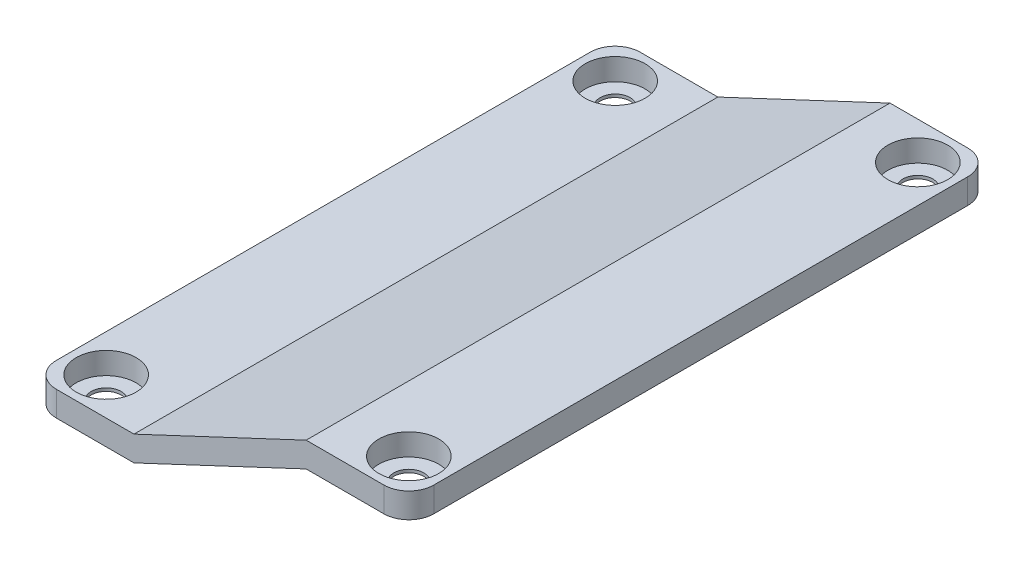
ISO-10303-21;
HEADER;
FILE_DESCRIPTION(('STEP AP214'),'2;1');
FILE_NAME('part.step','',(''),(''),'','','');
FILE_SCHEMA(('AUTOMOTIVE_DESIGN { 1 0 10303 214 1 1 1 1 }'));
ENDSEC;
DATA;
#1=APPLICATION_CONTEXT('core data for automotive mechanical design processes');
#2=APPLICATION_PROTOCOL_DEFINITION('international standard','automotive_design',2000,#1);
#3=PRODUCT_CONTEXT('',#1,'mechanical');
#4=PRODUCT('Part','Part','',(#3));
#5=PRODUCT_RELATED_PRODUCT_CATEGORY('part','',(#4));
#6=PRODUCT_DEFINITION_FORMATION('','',#4);
#7=PRODUCT_DEFINITION_CONTEXT('part definition',#1,'design');
#8=PRODUCT_DEFINITION('design','',#6,#7);
#9=PRODUCT_DEFINITION_SHAPE('','',#8);
#10=(LENGTH_UNIT() NAMED_UNIT(*) SI_UNIT(.MILLI.,.METRE.));
#11=(NAMED_UNIT(*) PLANE_ANGLE_UNIT() SI_UNIT($,.RADIAN.));
#12=(NAMED_UNIT(*) SI_UNIT($,.STERADIAN.) SOLID_ANGLE_UNIT());
#13=UNCERTAINTY_MEASURE_WITH_UNIT(LENGTH_MEASURE(1.E-05),#10,'distance_accuracy_value','');
#14=(GEOMETRIC_REPRESENTATION_CONTEXT(3) GLOBAL_UNCERTAINTY_ASSIGNED_CONTEXT((#13)) GLOBAL_UNIT_ASSIGNED_CONTEXT((#10,
#11,#12)) REPRESENTATION_CONTEXT('',''));
#15=CARTESIAN_POINT('',(0.,0.,0.));
#16=DIRECTION('',(0.,0.,1.));
#17=DIRECTION('',(1.,0.,0.));
#18=AXIS2_PLACEMENT_3D('',#15,#16,#17);
#19=CARTESIAN_POINT('',(-17.5077541769523,-9.56898329219079,-117.));
#20=DIRECTION('',(0.425038765055335,-0.905175147803029,0.));
#21=DIRECTION('',(0.905175147803029,0.425038765055335,0.));
#22=AXIS2_PLACEMENT_3D('',#19,#20,#21);
#23=PLANE('',#22);
#24=DIRECTION('',(0.905175147803029,0.425038765055335,0.));
#25=VECTOR('',#24,1.);
#26=CARTESIAN_POINT('',(-17.5077541769523,-9.56898329219079,0.));
#27=LINE('',#26,#25);
#28=CARTESIAN_POINT('',(-17.5077541769523,-9.56898329219079,0.));
#29=VERTEX_POINT('',#28);
#30=CARTESIAN_POINT('',(16.9922458230477,6.6310167078092,0.));
#31=VERTEX_POINT('',#30);
#32=EDGE_CURVE('E179',#29,#31,#27,.T.);
#33=ORIENTED_EDGE('',*,*,#32,.F.);
#34=DIRECTION('',(0.,0.,1.));
#35=VECTOR('',#34,1.);
#36=CARTESIAN_POINT('',(-17.5077541769523,-9.56898329219079,-117.));
#37=LINE('',#36,#35);
#38=CARTESIAN_POINT('',(-17.5077541769523,-9.56898329219079,-117.));
#39=VERTEX_POINT('',#38);
#40=EDGE_CURVE('E162',#39,#29,#37,.T.);
#41=ORIENTED_EDGE('',*,*,#40,.F.);
#42=DIRECTION('',(0.905175147803029,0.425038765055335,0.));
#43=VECTOR('',#42,1.);
#44=CARTESIAN_POINT('',(-17.5077541769523,-9.56898329219079,-117.));
#45=LINE('',#44,#43);
#46=CARTESIAN_POINT('',(16.9922458230477,6.6310167078092,-117.));
#47=VERTEX_POINT('',#46);
#48=EDGE_CURVE('E154',#39,#47,#45,.T.);
#49=ORIENTED_EDGE('',*,*,#48,.T.);
#50=DIRECTION('',(0.,0.,1.));
#51=VECTOR('',#50,1.);
#52=CARTESIAN_POINT('',(16.9922458230477,6.6310167078092,-117.));
#53=LINE('',#52,#51);
#54=EDGE_CURVE('E137',#47,#31,#53,.T.);
#55=ORIENTED_EDGE('',*,*,#54,.T.);
#56=EDGE_LOOP('',(#33,#41,#49,#55));
#57=FACE_BOUND('',#56,.T.);
#58=ADVANCED_FACE('F48',(#57),#23,.T.);
#59=CARTESIAN_POINT('',(-17.5077541769523,-9.56898329219079,-117.));
#60=DIRECTION('',(0.,-1.,0.));
#61=DIRECTION('',(1.,0.,0.));
#62=AXIS2_PLACEMENT_3D('',#59,#60,#61);
#63=PLANE('',#62);
#64=CARTESIAN_POINT('',(-30.5827541769523,-9.56898329219079,-109.5));
#65=DIRECTION('',(0.,1.,0.));
#66=DIRECTION('',(0.,0.,1.));
#67=AXIS2_PLACEMENT_3D('',#64,#65,#66);
#68=CIRCLE('',#67,3.);
#69=CARTESIAN_POINT('',(-30.5827541769523,-9.56898329219079,-106.5));
#70=VERTEX_POINT('',#69);
#71=EDGE_CURVE('E389',#70,#70,#68,.T.);
#72=ORIENTED_EDGE('',*,*,#71,.T.);
#73=EDGE_LOOP('',(#72));
#74=FACE_BOUND('',#73,.T.);
#75=CARTESIAN_POINT('',(-30.5827541769523,-9.56898329219079,-7.50000000000001));
#76=DIRECTION('',(0.,1.,0.));
#77=DIRECTION('',(0.,0.,1.));
#78=AXIS2_PLACEMENT_3D('',#75,#76,#77);
#79=CIRCLE('',#78,3.);
#80=CARTESIAN_POINT('',(-30.5827541769523,-9.56898329219079,-4.50000000000001));
#81=VERTEX_POINT('',#80);
#82=EDGE_CURVE('E168',#81,#81,#79,.T.);
#83=ORIENTED_EDGE('',*,*,#82,.T.);
#84=EDGE_LOOP('',(#83));
#85=FACE_BOUND('',#84,.T.);
#86=DIRECTION('',(0.,0.,1.));
#87=VECTOR('',#86,1.);
#88=CARTESIAN_POINT('',(-38.0827541769523,-9.5689832921908,-117.));
#89=LINE('',#88,#87);
#90=CARTESIAN_POINT('',(-38.0827541769523,-9.5689832921908,-112.));
#91=VERTEX_POINT('',#90);
#92=CARTESIAN_POINT('',(-38.0827541769523,-9.5689832921908,-5.));
#93=VERTEX_POINT('',#92);
#94=EDGE_CURVE('E191',#91,#93,#89,.T.);
#95=ORIENTED_EDGE('',*,*,#94,.F.);
#96=CARTESIAN_POINT('',(-33.0827541769523,-9.5689832921908,-112.));
#97=DIRECTION('',(0.,-1.,0.));
#98=DIRECTION('',(1.,0.,0.));
#99=AXIS2_PLACEMENT_3D('',#96,#97,#98);
#100=CIRCLE('',#99,5.);
#101=CARTESIAN_POINT('',(-33.0827541769523,-9.5689832921908,-117.));
#102=VERTEX_POINT('',#101);
#103=EDGE_CURVE('E212',#91,#102,#100,.T.);
#104=ORIENTED_EDGE('',*,*,#103,.T.);
#105=DIRECTION('',(1.,0.,0.));
#106=VECTOR('',#105,1.);
#107=CARTESIAN_POINT('',(-17.5077541769523,-9.56898329219079,-117.));
#108=LINE('',#107,#106);
#109=EDGE_CURVE('E148',#102,#39,#108,.T.);
#110=ORIENTED_EDGE('',*,*,#109,.T.);
#111=ORIENTED_EDGE('',*,*,#40,.T.);
#112=DIRECTION('',(1.,0.,0.));
#113=VECTOR('',#112,1.);
#114=CARTESIAN_POINT('',(-17.5077541769523,-9.56898329219079,0.));
#115=LINE('',#114,#113);
#116=CARTESIAN_POINT('',(-33.0827541769523,-9.5689832921908,0.));
#117=VERTEX_POINT('',#116);
#118=EDGE_CURVE('E163',#117,#29,#115,.T.);
#119=ORIENTED_EDGE('',*,*,#118,.F.);
#120=CARTESIAN_POINT('',(-33.0827541769523,-9.5689832921908,-5.));
#121=DIRECTION('',(0.,-1.,0.));
#122=DIRECTION('',(1.,0.,0.));
#123=AXIS2_PLACEMENT_3D('',#120,#121,#122);
#124=CIRCLE('',#123,5.);
#125=EDGE_CURVE('E210',#117,#93,#124,.T.);
#126=ORIENTED_EDGE('',*,*,#125,.T.);
#127=EDGE_LOOP('',(#95,#104,#110,#111,#119,#126));
#128=FACE_BOUND('',#127,.T.);
#129=ADVANCED_FACE('F241',(#74,#85,#128),#63,.T.);
#130=CARTESIAN_POINT('',(-38.0827541769523,-9.5689832921908,-117.));
#131=DIRECTION('',(-1.,0.,0.));
#132=DIRECTION('',(0.,0.,1.));
#133=AXIS2_PLACEMENT_3D('',#130,#131,#132);
#134=PLANE('',#133);
#135=DIRECTION('',(0.,0.,1.));
#136=VECTOR('',#135,1.);
#137=CARTESIAN_POINT('',(-38.0827541769523,-4.5689832921908,-117.));
#138=LINE('',#137,#136);
#139=CARTESIAN_POINT('',(-38.0827541769523,-4.5689832921908,-112.));
#140=VERTEX_POINT('',#139);
#141=CARTESIAN_POINT('',(-38.0827541769523,-4.5689832921908,-5.));
#142=VERTEX_POINT('',#141);
#143=EDGE_CURVE('E194',#140,#142,#138,.T.);
#144=ORIENTED_EDGE('',*,*,#143,.F.);
#145=DIRECTION('',(0.,-1.,0.));
#146=VECTOR('',#145,1.);
#147=CARTESIAN_POINT('',(-38.0827541769523,-9.5689832921908,-112.));
#148=LINE('',#147,#146);
#149=EDGE_CURVE('E207',#140,#91,#148,.T.);
#150=ORIENTED_EDGE('',*,*,#149,.T.);
#151=ORIENTED_EDGE('',*,*,#94,.T.);
#152=DIRECTION('',(0.,-1.,0.));
#153=VECTOR('',#152,1.);
#154=CARTESIAN_POINT('',(-38.0827541769523,-9.5689832921908,-5.));
#155=LINE('',#154,#153);
#156=EDGE_CURVE('E190',#93,#142,#155,.F.);
#157=ORIENTED_EDGE('',*,*,#156,.T.);
#158=EDGE_LOOP('',(#144,#150,#151,#157));
#159=FACE_BOUND('',#158,.T.);
#160=ADVANCED_FACE('F264',(#159),#134,.T.);
#161=CARTESIAN_POINT('',(-17.5077541769523,-4.5689832921908,-117.));
#162=DIRECTION('',(0.,1.,0.));
#163=DIRECTION('',(-1.,0.,0.));
#164=AXIS2_PLACEMENT_3D('',#161,#162,#163);
#165=PLANE('',#164);
#166=CARTESIAN_POINT('',(-30.5827541769523,-4.56898329219079,-109.5));
#167=DIRECTION('',(0.,1.,0.));
#168=DIRECTION('',(0.,0.,1.));
#169=AXIS2_PLACEMENT_3D('',#166,#167,#168);
#170=CIRCLE('',#169,6.);
#171=CARTESIAN_POINT('',(-30.5827541769523,-4.56898329219079,-103.5));
#172=VERTEX_POINT('',#171);
#173=EDGE_CURVE('E380',#172,#172,#170,.T.);
#174=ORIENTED_EDGE('',*,*,#173,.F.);
#175=EDGE_LOOP('',(#174));
#176=FACE_BOUND('',#175,.T.);
#177=CARTESIAN_POINT('',(-30.5827541769523,-4.56898329219079,-7.50000000000001));
#178=DIRECTION('',(0.,1.,0.));
#179=DIRECTION('',(0.,0.,1.));
#180=AXIS2_PLACEMENT_3D('',#177,#178,#179);
#181=CIRCLE('',#180,6.);
#182=CARTESIAN_POINT('',(-30.5827541769523,-4.56898329219079,-1.50000000000001));
#183=VERTEX_POINT('',#182);
#184=EDGE_CURVE('E392',#183,#183,#181,.T.);
#185=ORIENTED_EDGE('',*,*,#184,.F.);
#186=EDGE_LOOP('',(#185));
#187=FACE_BOUND('',#186,.T.);
#188=DIRECTION('',(-1.,0.,0.));
#189=VECTOR('',#188,1.);
#190=CARTESIAN_POINT('',(-17.5077541769523,-4.5689832921908,-117.));
#191=LINE('',#190,#189);
#192=CARTESIAN_POINT('',(-17.5077541769523,-4.5689832921908,-117.));
#193=VERTEX_POINT('',#192);
#194=CARTESIAN_POINT('',(-33.0827541769523,-4.5689832921908,-117.));
#195=VERTEX_POINT('',#194);
#196=EDGE_CURVE('E175',#193,#195,#191,.T.);
#197=ORIENTED_EDGE('',*,*,#196,.T.);
#198=CARTESIAN_POINT('',(-33.0827541769523,-4.5689832921908,-112.));
#199=DIRECTION('',(0.,1.,0.));
#200=DIRECTION('',(-1.,0.,0.));
#201=AXIS2_PLACEMENT_3D('',#198,#199,#200);
#202=CIRCLE('',#201,5.);
#203=EDGE_CURVE('E219',#195,#140,#202,.T.);
#204=ORIENTED_EDGE('',*,*,#203,.T.);
#205=ORIENTED_EDGE('',*,*,#143,.T.);
#206=CARTESIAN_POINT('',(-33.0827541769523,-4.5689832921908,-5.));
#207=DIRECTION('',(0.,1.,0.));
#208=DIRECTION('',(-1.,0.,0.));
#209=AXIS2_PLACEMENT_3D('',#206,#207,#208);
#210=CIRCLE('',#209,5.);
#211=CARTESIAN_POINT('',(-33.0827541769523,-4.5689832921908,0.));
#212=VERTEX_POINT('',#211);
#213=EDGE_CURVE('E217',#142,#212,#210,.T.);
#214=ORIENTED_EDGE('',*,*,#213,.T.);
#215=DIRECTION('',(-1.,0.,0.));
#216=VECTOR('',#215,1.);
#217=CARTESIAN_POINT('',(-17.5077541769523,-4.5689832921908,0.));
#218=LINE('',#217,#216);
#219=CARTESIAN_POINT('',(-17.5077541769523,-4.5689832921908,0.));
#220=VERTEX_POINT('',#219);
#221=EDGE_CURVE('E165',#220,#212,#218,.T.);
#222=ORIENTED_EDGE('',*,*,#221,.F.);
#223=DIRECTION('',(0.,0.,1.));
#224=VECTOR('',#223,1.);
#225=CARTESIAN_POINT('',(-17.5077541769523,-4.5689832921908,-117.));
#226=LINE('',#225,#224);
#227=EDGE_CURVE('E197',#193,#220,#226,.T.);
#228=ORIENTED_EDGE('',*,*,#227,.F.);
#229=EDGE_LOOP('',(#197,#204,#205,#214,#222,#228));
#230=FACE_BOUND('',#229,.T.);
#231=ADVANCED_FACE('F260',(#176,#187,#230),#165,.T.);
#232=CARTESIAN_POINT('',(-17.5077541769523,-4.5689832921908,-117.));
#233=DIRECTION('',(-0.425038765055335,0.905175147803029,0.));
#234=DIRECTION('',(-0.905175147803029,-0.425038765055335,0.));
#235=AXIS2_PLACEMENT_3D('',#232,#233,#234);
#236=PLANE('',#235);
#237=DIRECTION('',(-0.905175147803029,-0.425038765055335,0.));
#238=VECTOR('',#237,1.);
#239=CARTESIAN_POINT('',(-17.5077541769523,-4.5689832921908,0.));
#240=LINE('',#239,#238);
#241=CARTESIAN_POINT('',(16.9922458230477,11.6310167078092,0.));
#242=VERTEX_POINT('',#241);
#243=EDGE_CURVE('E184',#242,#220,#240,.T.);
#244=ORIENTED_EDGE('',*,*,#243,.F.);
#245=DIRECTION('',(0.,0.,1.));
#246=VECTOR('',#245,1.);
#247=CARTESIAN_POINT('',(16.9922458230477,11.6310167078092,-117.));
#248=LINE('',#247,#246);
#249=CARTESIAN_POINT('',(16.9922458230477,11.6310167078092,-117.));
#250=VERTEX_POINT('',#249);
#251=EDGE_CURVE('E199',#250,#242,#248,.T.);
#252=ORIENTED_EDGE('',*,*,#251,.F.);
#253=DIRECTION('',(-0.905175147803029,-0.425038765055335,0.));
#254=VECTOR('',#253,1.);
#255=CARTESIAN_POINT('',(-17.5077541769523,-4.5689832921908,-117.));
#256=LINE('',#255,#254);
#257=EDGE_CURVE('E172',#250,#193,#256,.T.);
#258=ORIENTED_EDGE('',*,*,#257,.T.);
#259=ORIENTED_EDGE('',*,*,#227,.T.);
#260=EDGE_LOOP('',(#244,#252,#258,#259));
#261=FACE_BOUND('',#260,.T.);
#262=ADVANCED_FACE('F256',(#261),#236,.T.);
#263=CARTESIAN_POINT('',(16.9922458230477,11.6310167078092,-117.));
#264=DIRECTION('',(0.,1.,0.));
#265=DIRECTION('',(-1.,0.,0.));
#266=AXIS2_PLACEMENT_3D('',#263,#264,#265);
#267=PLANE('',#266);
#268=CARTESIAN_POINT('',(30.0672458230477,11.6310167078092,-7.5));
#269=DIRECTION('',(0.,1.,0.));
#270=DIRECTION('',(0.,0.,1.));
#271=AXIS2_PLACEMENT_3D('',#268,#269,#270);
#272=CIRCLE('',#271,6.);
#273=CARTESIAN_POINT('',(30.0672458230477,11.6310167078092,-1.5));
#274=VERTEX_POINT('',#273);
#275=EDGE_CURVE('E359',#274,#274,#272,.T.);
#276=ORIENTED_EDGE('',*,*,#275,.F.);
#277=EDGE_LOOP('',(#276));
#278=FACE_BOUND('',#277,.T.);
#279=CARTESIAN_POINT('',(30.0672458230477,11.6310167078092,-109.5));
#280=DIRECTION('',(0.,1.,0.));
#281=DIRECTION('',(0.,0.,1.));
#282=AXIS2_PLACEMENT_3D('',#279,#280,#281);
#283=CIRCLE('',#282,6.);
#284=CARTESIAN_POINT('',(30.0672458230477,11.6310167078092,-103.5));
#285=VERTEX_POINT('',#284);
#286=EDGE_CURVE('E368',#285,#285,#283,.T.);
#287=ORIENTED_EDGE('',*,*,#286,.F.);
#288=EDGE_LOOP('',(#287));
#289=FACE_BOUND('',#288,.T.);
#290=DIRECTION('',(0.,0.,1.));
#291=VECTOR('',#290,1.);
#292=CARTESIAN_POINT('',(37.5672458230477,11.6310167078092,-117.));
#293=LINE('',#292,#291);
#294=CARTESIAN_POINT('',(37.5672458230477,11.6310167078092,-112.));
#295=VERTEX_POINT('',#294);
#296=CARTESIAN_POINT('',(37.5672458230477,11.6310167078092,-5.));
#297=VERTEX_POINT('',#296);
#298=EDGE_CURVE('E202',#295,#297,#293,.T.);
#299=ORIENTED_EDGE('',*,*,#298,.F.);
#300=CARTESIAN_POINT('',(32.5672458230477,11.6310167078092,-112.));
#301=DIRECTION('',(0.,1.,0.));
#302=DIRECTION('',(-1.,0.,0.));
#303=AXIS2_PLACEMENT_3D('',#300,#301,#302);
#304=CIRCLE('',#303,5.);
#305=CARTESIAN_POINT('',(32.5672458230477,11.6310167078092,-117.));
#306=VERTEX_POINT('',#305);
#307=EDGE_CURVE('E227',#295,#306,#304,.T.);
#308=ORIENTED_EDGE('',*,*,#307,.T.);
#309=DIRECTION('',(-1.,0.,0.));
#310=VECTOR('',#309,1.);
#311=CARTESIAN_POINT('',(16.9922458230477,11.6310167078092,-117.));
#312=LINE('',#311,#310);
#313=EDGE_CURVE('E158',#306,#250,#312,.T.);
#314=ORIENTED_EDGE('',*,*,#313,.T.);
#315=ORIENTED_EDGE('',*,*,#251,.T.);
#316=DIRECTION('',(-1.,0.,0.));
#317=VECTOR('',#316,1.);
#318=CARTESIAN_POINT('',(16.9922458230477,11.6310167078092,0.));
#319=LINE('',#318,#317);
#320=CARTESIAN_POINT('',(32.5672458230477,11.6310167078092,0.));
#321=VERTEX_POINT('',#320);
#322=EDGE_CURVE('E182',#321,#242,#319,.T.);
#323=ORIENTED_EDGE('',*,*,#322,.F.);
#324=CARTESIAN_POINT('',(32.5672458230477,11.6310167078092,-5.));
#325=DIRECTION('',(0.,1.,0.));
#326=DIRECTION('',(-1.,0.,0.));
#327=AXIS2_PLACEMENT_3D('',#324,#325,#326);
#328=CIRCLE('',#327,5.);
#329=EDGE_CURVE('E71',#321,#297,#328,.T.);
#330=ORIENTED_EDGE('',*,*,#329,.T.);
#331=EDGE_LOOP('',(#299,#308,#314,#315,#323,#330));
#332=FACE_BOUND('',#331,.T.);
#333=ADVANCED_FACE('F252',(#278,#289,#332),#267,.T.);
#334=CARTESIAN_POINT('',(37.5672458230477,6.6310167078092,-117.));
#335=DIRECTION('',(1.,0.,0.));
#336=DIRECTION('',(0.,0.,-1.));
#337=AXIS2_PLACEMENT_3D('',#334,#335,#336);
#338=PLANE('',#337);
#339=DIRECTION('',(0.,0.,1.));
#340=VECTOR('',#339,1.);
#341=CARTESIAN_POINT('',(37.5672458230477,6.6310167078092,-117.));
#342=LINE('',#341,#340);
#343=CARTESIAN_POINT('',(37.5672458230477,6.6310167078092,-112.));
#344=VERTEX_POINT('',#343);
#345=CARTESIAN_POINT('',(37.5672458230477,6.6310167078092,-5.));
#346=VERTEX_POINT('',#345);
#347=EDGE_CURVE('E147',#344,#346,#342,.T.);
#348=ORIENTED_EDGE('',*,*,#347,.F.);
#349=DIRECTION('',(0.,1.,0.));
#350=VECTOR('',#349,1.);
#351=CARTESIAN_POINT('',(37.5672458230477,11.6310167078092,-112.));
#352=LINE('',#351,#350);
#353=EDGE_CURVE('E223',#344,#295,#352,.T.);
#354=ORIENTED_EDGE('',*,*,#353,.T.);
#355=ORIENTED_EDGE('',*,*,#298,.T.);
#356=DIRECTION('',(0.,1.,0.));
#357=VECTOR('',#356,1.);
#358=CARTESIAN_POINT('',(37.5672458230477,6.6310167078092,-5.));
#359=LINE('',#358,#357);
#360=EDGE_CURVE('E221',#297,#346,#359,.F.);
#361=ORIENTED_EDGE('',*,*,#360,.T.);
#362=EDGE_LOOP('',(#348,#354,#355,#361));
#363=FACE_BOUND('',#362,.T.);
#364=ADVANCED_FACE('F246',(#363),#338,.T.);
#365=CARTESIAN_POINT('',(16.9922458230477,6.6310167078092,-117.));
#366=DIRECTION('',(0.,-1.,0.));
#367=DIRECTION('',(0.,0.,-1.));
#368=AXIS2_PLACEMENT_3D('',#365,#366,#367);
#369=PLANE('',#368);
#370=CARTESIAN_POINT('',(30.0672458230477,6.6310167078092,-7.5));
#371=DIRECTION('',(0.,-1.,0.));
#372=DIRECTION('',(0.,0.,-1.));
#373=AXIS2_PLACEMENT_3D('',#370,#371,#372);
#374=CIRCLE('',#373,3.);
#375=CARTESIAN_POINT('',(30.0672458230477,6.6310167078092,-10.5));
#376=VERTEX_POINT('',#375);
#377=EDGE_CURVE('E361',#376,#376,#374,.T.);
#378=ORIENTED_EDGE('',*,*,#377,.F.);
#379=EDGE_LOOP('',(#378));
#380=FACE_BOUND('',#379,.T.);
#381=CARTESIAN_POINT('',(30.0672458230477,6.6310167078092,-109.5));
#382=DIRECTION('',(0.,-1.,0.));
#383=DIRECTION('',(0.,0.,-1.));
#384=AXIS2_PLACEMENT_3D('',#381,#382,#383);
#385=CIRCLE('',#384,3.);
#386=CARTESIAN_POINT('',(30.0672458230477,6.6310167078092,-112.5));
#387=VERTEX_POINT('',#386);
#388=EDGE_CURVE('E377',#387,#387,#385,.T.);
#389=ORIENTED_EDGE('',*,*,#388,.F.);
#390=EDGE_LOOP('',(#389));
#391=FACE_BOUND('',#390,.T.);
#392=DIRECTION('',(1.,0.,0.));
#393=VECTOR('',#392,1.);
#394=CARTESIAN_POINT('',(16.9922458230477,6.6310167078092,-117.));
#395=LINE('',#394,#393);
#396=CARTESIAN_POINT('',(32.5672458230477,6.6310167078092,-117.));
#397=VERTEX_POINT('',#396);
#398=EDGE_CURVE('E140',#47,#397,#395,.T.);
#399=ORIENTED_EDGE('',*,*,#398,.T.);
#400=CARTESIAN_POINT('',(32.5672458230477,6.6310167078092,-112.));
#401=DIRECTION('',(0.,-1.,0.));
#402=DIRECTION('',(0.,0.,-1.));
#403=AXIS2_PLACEMENT_3D('',#400,#401,#402);
#404=CIRCLE('',#403,5.);
#405=EDGE_CURVE('E230',#397,#344,#404,.T.);
#406=ORIENTED_EDGE('',*,*,#405,.T.);
#407=ORIENTED_EDGE('',*,*,#347,.T.);
#408=CARTESIAN_POINT('',(32.5672458230477,6.6310167078092,-5.));
#409=DIRECTION('',(0.,-1.,0.));
#410=DIRECTION('',(0.,0.,-1.));
#411=AXIS2_PLACEMENT_3D('',#408,#409,#410);
#412=CIRCLE('',#411,5.);
#413=CARTESIAN_POINT('',(32.5672458230477,6.6310167078092,0.));
#414=VERTEX_POINT('',#413);
#415=EDGE_CURVE('E63',#346,#414,#412,.T.);
#416=ORIENTED_EDGE('',*,*,#415,.T.);
#417=DIRECTION('',(1.,0.,0.));
#418=VECTOR('',#417,1.);
#419=CARTESIAN_POINT('',(16.9922458230477,6.6310167078092,0.));
#420=LINE('',#419,#418);
#421=EDGE_CURVE('E142',#31,#414,#420,.T.);
#422=ORIENTED_EDGE('',*,*,#421,.F.);
#423=ORIENTED_EDGE('',*,*,#54,.F.);
#424=EDGE_LOOP('',(#399,#406,#407,#416,#422,#423));
#425=FACE_BOUND('',#424,.T.);
#426=ADVANCED_FACE('F139',(#380,#391,#425),#369,.T.);
#427=CARTESIAN_POINT('',(0.,0.,-117.));
#428=DIRECTION('',(0.,0.,1.));
#429=DIRECTION('',(1.,0.,0.));
#430=AXIS2_PLACEMENT_3D('',#427,#428,#429);
#431=PLANE('',#430);
#432=ORIENTED_EDGE('',*,*,#109,.F.);
#433=DIRECTION('',(0.,-1.,0.));
#434=VECTOR('',#433,1.);
#435=CARTESIAN_POINT('',(-33.0827541769523,-4.5689832921908,-117.));
#436=LINE('',#435,#434);
#437=EDGE_CURVE('E215',#102,#195,#436,.F.);
#438=ORIENTED_EDGE('',*,*,#437,.T.);
#439=ORIENTED_EDGE('',*,*,#196,.F.);
#440=ORIENTED_EDGE('',*,*,#257,.F.);
#441=ORIENTED_EDGE('',*,*,#313,.F.);
#442=DIRECTION('',(0.,1.,0.));
#443=VECTOR('',#442,1.);
#444=CARTESIAN_POINT('',(32.5672458230477,6.6310167078092,-117.));
#445=LINE('',#444,#443);
#446=EDGE_CURVE('E157',#306,#397,#445,.F.);
#447=ORIENTED_EDGE('',*,*,#446,.T.);
#448=ORIENTED_EDGE('',*,*,#398,.F.);
#449=ORIENTED_EDGE('',*,*,#48,.F.);
#450=EDGE_LOOP('',(#432,#438,#439,#440,#441,#447,#448,#449));
#451=FACE_BOUND('',#450,.T.);
#452=ADVANCED_FACE('F153',(#451),#431,.F.);
#453=CARTESIAN_POINT('',(0.,0.,0.));
#454=DIRECTION('',(0.,0.,1.));
#455=DIRECTION('',(1.,0.,0.));
#456=AXIS2_PLACEMENT_3D('',#453,#454,#455);
#457=PLANE('',#456);
#458=ORIENTED_EDGE('',*,*,#421,.T.);
#459=DIRECTION('',(0.,1.,0.));
#460=VECTOR('',#459,1.);
#461=CARTESIAN_POINT('',(32.5672458230477,0.,0.));
#462=LINE('',#461,#460);
#463=EDGE_CURVE('E13',#414,#321,#462,.T.);
#464=ORIENTED_EDGE('',*,*,#463,.T.);
#465=ORIENTED_EDGE('',*,*,#322,.T.);
#466=ORIENTED_EDGE('',*,*,#243,.T.);
#467=ORIENTED_EDGE('',*,*,#221,.T.);
#468=DIRECTION('',(0.,-1.,0.));
#469=VECTOR('',#468,1.);
#470=CARTESIAN_POINT('',(-33.0827541769523,0.,0.));
#471=LINE('',#470,#469);
#472=EDGE_CURVE('E56',#212,#117,#471,.T.);
#473=ORIENTED_EDGE('',*,*,#472,.T.);
#474=ORIENTED_EDGE('',*,*,#118,.T.);
#475=ORIENTED_EDGE('',*,*,#32,.T.);
#476=EDGE_LOOP('',(#458,#464,#465,#466,#467,#473,#474,#475));
#477=FACE_BOUND('',#476,.T.);
#478=ADVANCED_FACE('F235',(#477),#457,.T.);
#479=CARTESIAN_POINT('',(-30.5827541769523,-4.56898329219079,-7.50000000000001));
#480=DIRECTION('',(0.,1.,0.));
#481=DIRECTION('',(0.,0.,1.));
#482=AXIS2_PLACEMENT_3D('',#479,#480,#481);
#483=CYLINDRICAL_SURFACE('',#482,3.);
#484=ORIENTED_EDGE('',*,*,#82,.F.);
#485=EDGE_LOOP('',(#484));
#486=FACE_BOUND('',#485,.T.);
#487=CARTESIAN_POINT('',(-30.5827541769523,-8.94898329219079,-7.50000000000001));
#488=DIRECTION('',(0.,1.,0.));
#489=DIRECTION('',(0.,0.,1.));
#490=AXIS2_PLACEMENT_3D('',#487,#488,#489);
#491=CIRCLE('',#490,3.);
#492=CARTESIAN_POINT('',(-30.5827541769523,-8.94898329219079,-4.50000000000001));
#493=VERTEX_POINT('',#492);
#494=EDGE_CURVE('E397',#493,#493,#491,.T.);
#495=ORIENTED_EDGE('',*,*,#494,.T.);
#496=EDGE_LOOP('',(#495));
#497=FACE_BOUND('',#496,.T.);
#498=ADVANCED_FACE('F306',(#486,#497),#483,.F.);
#499=CARTESIAN_POINT('',(-27.5827541769523,-8.94898329219079,-7.50000000000001));
#500=DIRECTION('',(0.,-1.,0.));
#501=DIRECTION('',(0.,0.,-1.));
#502=AXIS2_PLACEMENT_3D('',#499,#500,#501);
#503=PLANE('',#502);
#504=ORIENTED_EDGE('',*,*,#494,.F.);
#505=EDGE_LOOP('',(#504));
#506=FACE_BOUND('',#505,.T.);
#507=CARTESIAN_POINT('',(-30.5827541769523,-8.94898329219079,-7.50000000000001));
#508=DIRECTION('',(0.,1.,0.));
#509=DIRECTION('',(0.,0.,1.));
#510=AXIS2_PLACEMENT_3D('',#507,#508,#509);
#511=CIRCLE('',#510,6.);
#512=CARTESIAN_POINT('',(-30.5827541769523,-8.94898329219079,-1.50000000000001));
#513=VERTEX_POINT('',#512);
#514=EDGE_CURVE('E395',#513,#513,#511,.T.);
#515=ORIENTED_EDGE('',*,*,#514,.T.);
#516=EDGE_LOOP('',(#515));
#517=FACE_BOUND('',#516,.T.);
#518=ADVANCED_FACE('F311',(#506,#517),#503,.F.);
#519=CARTESIAN_POINT('',(-30.5827541769523,-4.56898329219079,-7.50000000000001));
#520=DIRECTION('',(0.,1.,0.));
#521=DIRECTION('',(0.,0.,1.));
#522=AXIS2_PLACEMENT_3D('',#519,#520,#521);
#523=CYLINDRICAL_SURFACE('',#522,6.);
#524=ORIENTED_EDGE('',*,*,#514,.F.);
#525=EDGE_LOOP('',(#524));
#526=FACE_BOUND('',#525,.T.);
#527=ORIENTED_EDGE('',*,*,#184,.T.);
#528=EDGE_LOOP('',(#527));
#529=FACE_BOUND('',#528,.T.);
#530=ADVANCED_FACE('F315',(#526,#529),#523,.F.);
#531=CARTESIAN_POINT('',(-30.5827541769523,-4.56898329219079,-109.5));
#532=DIRECTION('',(0.,1.,0.));
#533=DIRECTION('',(0.,0.,1.));
#534=AXIS2_PLACEMENT_3D('',#531,#532,#533);
#535=CYLINDRICAL_SURFACE('',#534,3.);
#536=ORIENTED_EDGE('',*,*,#71,.F.);
#537=EDGE_LOOP('',(#536));
#538=FACE_BOUND('',#537,.T.);
#539=CARTESIAN_POINT('',(-30.5827541769523,-8.94898329219079,-109.5));
#540=DIRECTION('',(0.,1.,0.));
#541=DIRECTION('',(0.,0.,1.));
#542=AXIS2_PLACEMENT_3D('',#539,#540,#541);
#543=CIRCLE('',#542,3.);
#544=CARTESIAN_POINT('',(-30.5827541769523,-8.94898329219079,-106.5));
#545=VERTEX_POINT('',#544);
#546=EDGE_CURVE('E386',#545,#545,#543,.T.);
#547=ORIENTED_EDGE('',*,*,#546,.T.);
#548=EDGE_LOOP('',(#547));
#549=FACE_BOUND('',#548,.T.);
#550=ADVANCED_FACE('F319',(#538,#549),#535,.F.);
#551=CARTESIAN_POINT('',(-27.5827541769523,-8.94898329219079,-109.5));
#552=DIRECTION('',(0.,-1.,0.));
#553=DIRECTION('',(0.,0.,-1.));
#554=AXIS2_PLACEMENT_3D('',#551,#552,#553);
#555=PLANE('',#554);
#556=ORIENTED_EDGE('',*,*,#546,.F.);
#557=EDGE_LOOP('',(#556));
#558=FACE_BOUND('',#557,.T.);
#559=CARTESIAN_POINT('',(-30.5827541769523,-8.94898329219079,-109.5));
#560=DIRECTION('',(0.,1.,0.));
#561=DIRECTION('',(0.,0.,1.));
#562=AXIS2_PLACEMENT_3D('',#559,#560,#561);
#563=CIRCLE('',#562,6.);
#564=CARTESIAN_POINT('',(-30.5827541769523,-8.94898329219079,-103.5));
#565=VERTEX_POINT('',#564);
#566=EDGE_CURVE('E383',#565,#565,#563,.T.);
#567=ORIENTED_EDGE('',*,*,#566,.T.);
#568=EDGE_LOOP('',(#567));
#569=FACE_BOUND('',#568,.T.);
#570=ADVANCED_FACE('F323',(#558,#569),#555,.F.);
#571=CARTESIAN_POINT('',(-30.5827541769523,-4.56898329219079,-109.5));
#572=DIRECTION('',(0.,1.,0.));
#573=DIRECTION('',(0.,0.,1.));
#574=AXIS2_PLACEMENT_3D('',#571,#572,#573);
#575=CYLINDRICAL_SURFACE('',#574,6.);
#576=ORIENTED_EDGE('',*,*,#566,.F.);
#577=EDGE_LOOP('',(#576));
#578=FACE_BOUND('',#577,.T.);
#579=ORIENTED_EDGE('',*,*,#173,.T.);
#580=EDGE_LOOP('',(#579));
#581=FACE_BOUND('',#580,.T.);
#582=ADVANCED_FACE('F327',(#578,#581),#575,.F.);
#583=CARTESIAN_POINT('',(30.0672458230477,11.6310167078092,-109.5));
#584=DIRECTION('',(0.,1.,0.));
#585=DIRECTION('',(0.,0.,1.));
#586=AXIS2_PLACEMENT_3D('',#583,#584,#585);
#587=CYLINDRICAL_SURFACE('',#586,3.);
#588=CARTESIAN_POINT('',(30.0672458230477,7.2510167078092,-109.5));
#589=DIRECTION('',(0.,1.,0.));
#590=DIRECTION('',(0.,0.,1.));
#591=AXIS2_PLACEMENT_3D('',#588,#589,#590);
#592=CIRCLE('',#591,3.);
#593=CARTESIAN_POINT('',(30.0672458230477,7.2510167078092,-106.5));
#594=VERTEX_POINT('',#593);
#595=EDGE_CURVE('E374',#594,#594,#592,.T.);
#596=ORIENTED_EDGE('',*,*,#595,.T.);
#597=EDGE_LOOP('',(#596));
#598=FACE_BOUND('',#597,.T.);
#599=ORIENTED_EDGE('',*,*,#388,.T.);
#600=EDGE_LOOP('',(#599));
#601=FACE_BOUND('',#600,.T.);
#602=ADVANCED_FACE('F331',(#598,#601),#587,.F.);
#603=CARTESIAN_POINT('',(33.0672458230477,7.2510167078092,-109.5));
#604=DIRECTION('',(0.,-1.,0.));
#605=DIRECTION('',(0.,0.,-1.));
#606=AXIS2_PLACEMENT_3D('',#603,#604,#605);
#607=PLANE('',#606);
#608=ORIENTED_EDGE('',*,*,#595,.F.);
#609=EDGE_LOOP('',(#608));
#610=FACE_BOUND('',#609,.T.);
#611=CARTESIAN_POINT('',(30.0672458230477,7.2510167078092,-109.5));
#612=DIRECTION('',(0.,1.,0.));
#613=DIRECTION('',(0.,0.,1.));
#614=AXIS2_PLACEMENT_3D('',#611,#612,#613);
#615=CIRCLE('',#614,6.);
#616=CARTESIAN_POINT('',(30.0672458230477,7.2510167078092,-103.5));
#617=VERTEX_POINT('',#616);
#618=EDGE_CURVE('E371',#617,#617,#615,.T.);
#619=ORIENTED_EDGE('',*,*,#618,.T.);
#620=EDGE_LOOP('',(#619));
#621=FACE_BOUND('',#620,.T.);
#622=ADVANCED_FACE('F335',(#610,#621),#607,.F.);
#623=CARTESIAN_POINT('',(30.0672458230477,11.6310167078092,-109.5));
#624=DIRECTION('',(0.,1.,0.));
#625=DIRECTION('',(0.,0.,1.));
#626=AXIS2_PLACEMENT_3D('',#623,#624,#625);
#627=CYLINDRICAL_SURFACE('',#626,6.);
#628=ORIENTED_EDGE('',*,*,#618,.F.);
#629=EDGE_LOOP('',(#628));
#630=FACE_BOUND('',#629,.T.);
#631=ORIENTED_EDGE('',*,*,#286,.T.);
#632=EDGE_LOOP('',(#631));
#633=FACE_BOUND('',#632,.T.);
#634=ADVANCED_FACE('F339',(#630,#633),#627,.F.);
#635=CARTESIAN_POINT('',(30.0672458230477,11.6310167078092,-7.5));
#636=DIRECTION('',(0.,1.,0.));
#637=DIRECTION('',(0.,0.,1.));
#638=AXIS2_PLACEMENT_3D('',#635,#636,#637);
#639=CYLINDRICAL_SURFACE('',#638,3.);
#640=CARTESIAN_POINT('',(30.0672458230477,7.2510167078092,-7.5));
#641=DIRECTION('',(0.,1.,0.));
#642=DIRECTION('',(0.,0.,1.));
#643=AXIS2_PLACEMENT_3D('',#640,#641,#642);
#644=CIRCLE('',#643,3.);
#645=CARTESIAN_POINT('',(30.0672458230477,7.2510167078092,-4.5));
#646=VERTEX_POINT('',#645);
#647=EDGE_CURVE('E355',#646,#646,#644,.T.);
#648=ORIENTED_EDGE('',*,*,#647,.T.);
#649=EDGE_LOOP('',(#648));
#650=FACE_BOUND('',#649,.T.);
#651=ORIENTED_EDGE('',*,*,#377,.T.);
#652=EDGE_LOOP('',(#651));
#653=FACE_BOUND('',#652,.T.);
#654=ADVANCED_FACE('F343',(#650,#653),#639,.F.);
#655=CARTESIAN_POINT('',(33.0672458230477,7.2510167078092,-7.5));
#656=DIRECTION('',(0.,-1.,0.));
#657=DIRECTION('',(0.,0.,-1.));
#658=AXIS2_PLACEMENT_3D('',#655,#656,#657);
#659=PLANE('',#658);
#660=ORIENTED_EDGE('',*,*,#647,.F.);
#661=EDGE_LOOP('',(#660));
#662=FACE_BOUND('',#661,.T.);
#663=CARTESIAN_POINT('',(30.0672458230477,7.2510167078092,-7.5));
#664=DIRECTION('',(0.,1.,0.));
#665=DIRECTION('',(0.,0.,1.));
#666=AXIS2_PLACEMENT_3D('',#663,#664,#665);
#667=CIRCLE('',#666,6.);
#668=CARTESIAN_POINT('',(30.0672458230477,7.2510167078092,-1.5));
#669=VERTEX_POINT('',#668);
#670=EDGE_CURVE('E358',#669,#669,#667,.T.);
#671=ORIENTED_EDGE('',*,*,#670,.T.);
#672=EDGE_LOOP('',(#671));
#673=FACE_BOUND('',#672,.T.);
#674=ADVANCED_FACE('F278',(#662,#673),#659,.F.);
#675=CARTESIAN_POINT('',(30.0672458230477,11.6310167078092,-7.5));
#676=DIRECTION('',(0.,1.,0.));
#677=DIRECTION('',(0.,0.,1.));
#678=AXIS2_PLACEMENT_3D('',#675,#676,#677);
#679=CYLINDRICAL_SURFACE('',#678,6.);
#680=ORIENTED_EDGE('',*,*,#670,.F.);
#681=EDGE_LOOP('',(#680));
#682=FACE_BOUND('',#681,.T.);
#683=ORIENTED_EDGE('',*,*,#275,.T.);
#684=EDGE_LOOP('',(#683));
#685=FACE_BOUND('',#684,.T.);
#686=ADVANCED_FACE('F271',(#682,#685),#679,.F.);
#687=CARTESIAN_POINT('',(-33.0827541769523,-9.5689832921908,-112.));
#688=DIRECTION('',(0.,1.,0.));
#689=DIRECTION('',(0.,0.,1.));
#690=AXIS2_PLACEMENT_3D('',#687,#688,#689);
#691=CYLINDRICAL_SURFACE('',#690,5.);
#692=ORIENTED_EDGE('',*,*,#203,.F.);
#693=ORIENTED_EDGE('',*,*,#437,.F.);
#694=ORIENTED_EDGE('',*,*,#103,.F.);
#695=ORIENTED_EDGE('',*,*,#149,.F.);
#696=EDGE_LOOP('',(#692,#693,#694,#695));
#697=FACE_BOUND('',#696,.T.);
#698=ADVANCED_FACE('F269',(#697),#691,.T.);
#699=CARTESIAN_POINT('',(32.5672458230477,6.6310167078092,-112.));
#700=DIRECTION('',(0.,-1.,0.));
#701=DIRECTION('',(0.,0.,-1.));
#702=AXIS2_PLACEMENT_3D('',#699,#700,#701);
#703=CYLINDRICAL_SURFACE('',#702,5.);
#704=ORIENTED_EDGE('',*,*,#405,.F.);
#705=ORIENTED_EDGE('',*,*,#446,.F.);
#706=ORIENTED_EDGE('',*,*,#307,.F.);
#707=ORIENTED_EDGE('',*,*,#353,.F.);
#708=EDGE_LOOP('',(#704,#705,#706,#707));
#709=FACE_BOUND('',#708,.T.);
#710=ADVANCED_FACE('F250',(#709),#703,.T.);
#711=CARTESIAN_POINT('',(32.5672458230477,0.,-5.));
#712=DIRECTION('',(0.,1.,0.));
#713=DIRECTION('',(0.,0.,1.));
#714=AXIS2_PLACEMENT_3D('',#711,#712,#713);
#715=CYLINDRICAL_SURFACE('',#714,5.);
#716=ORIENTED_EDGE('',*,*,#415,.F.);
#717=ORIENTED_EDGE('',*,*,#360,.F.);
#718=ORIENTED_EDGE('',*,*,#329,.F.);
#719=ORIENTED_EDGE('',*,*,#463,.F.);
#720=EDGE_LOOP('',(#716,#717,#718,#719));
#721=FACE_BOUND('',#720,.T.);
#722=ADVANCED_FACE('F243',(#721),#715,.T.);
#723=CARTESIAN_POINT('',(-33.0827541769523,0.,-5.));
#724=DIRECTION('',(0.,-1.,0.));
#725=DIRECTION('',(0.,0.,-1.));
#726=AXIS2_PLACEMENT_3D('',#723,#724,#725);
#727=CYLINDRICAL_SURFACE('',#726,5.);
#728=ORIENTED_EDGE('',*,*,#213,.F.);
#729=ORIENTED_EDGE('',*,*,#156,.F.);
#730=ORIENTED_EDGE('',*,*,#125,.F.);
#731=ORIENTED_EDGE('',*,*,#472,.F.);
#732=EDGE_LOOP('',(#728,#729,#730,#731));
#733=FACE_BOUND('',#732,.T.);
#734=ADVANCED_FACE('F50',(#733),#727,.T.);
#735=CLOSED_SHELL('',(#58,#129,#160,#231,#262,#333,#364,#426,#452,#478,#498,#518,#530,#550,#570,
#582,#602,#622,#634,#654,#674,#686,#698,#710,#722,#734));
#736=MANIFOLD_SOLID_BREP('B2',#735);
#737=ADVANCED_BREP_SHAPE_REPRESENTATION('',(#18,#736),#14);
#738=SHAPE_DEFINITION_REPRESENTATION(#9,#737);
ENDSEC;
END-ISO-10303-21;
